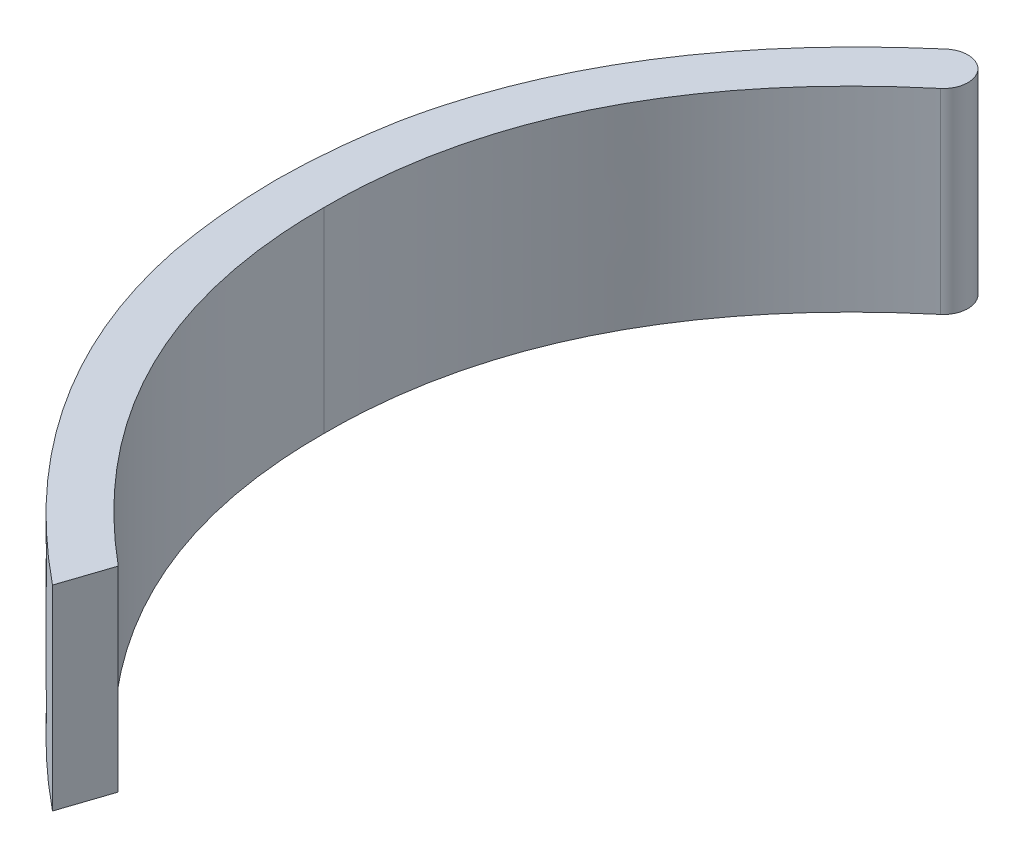
ISO-10303-21;
HEADER;
FILE_DESCRIPTION(('STEP AP214'),'2;1');
FILE_NAME('part.step','',(''),(''),'','','');
FILE_SCHEMA(('AUTOMOTIVE_DESIGN { 1 0 10303 214 1 1 1 1 }'));
ENDSEC;
DATA;
#1=APPLICATION_CONTEXT('core data for automotive mechanical design processes');
#2=APPLICATION_PROTOCOL_DEFINITION('international standard','automotive_design',2000,#1);
#3=PRODUCT_CONTEXT('',#1,'mechanical');
#4=PRODUCT('Part','Part','',(#3));
#5=PRODUCT_RELATED_PRODUCT_CATEGORY('part','',(#4));
#6=PRODUCT_DEFINITION_FORMATION('','',#4);
#7=PRODUCT_DEFINITION_CONTEXT('part definition',#1,'design');
#8=PRODUCT_DEFINITION('design','',#6,#7);
#9=PRODUCT_DEFINITION_SHAPE('','',#8);
#10=(LENGTH_UNIT() NAMED_UNIT(*) SI_UNIT(.MILLI.,.METRE.));
#11=(NAMED_UNIT(*) PLANE_ANGLE_UNIT() SI_UNIT($,.RADIAN.));
#12=(NAMED_UNIT(*) SI_UNIT($,.STERADIAN.) SOLID_ANGLE_UNIT());
#13=UNCERTAINTY_MEASURE_WITH_UNIT(LENGTH_MEASURE(1.E-05),#10,'distance_accuracy_value','');
#14=(GEOMETRIC_REPRESENTATION_CONTEXT(3) GLOBAL_UNCERTAINTY_ASSIGNED_CONTEXT((#13)) GLOBAL_UNIT_ASSIGNED_CONTEXT((#10,
#11,#12)) REPRESENTATION_CONTEXT('',''));
#15=CARTESIAN_POINT('',(0.,0.,0.));
#16=DIRECTION('',(0.,0.,1.));
#17=DIRECTION('',(1.,0.,0.));
#18=AXIS2_PLACEMENT_3D('',#15,#16,#17);
#19=CARTESIAN_POINT('',(0.,8.,-17.5));
#20=CARTESIAN_POINT('',(-11.3376797968367,8.,-8.58574448251679));
#21=CARTESIAN_POINT('',(-8.75,8.,4.60786437626908));
#22=B_SPLINE_CURVE_WITH_KNOTS('',2,(#19,#20,#21),.UNSPECIFIED.,.F.,.F.,(3,3),(0.,1.),.UNSPECIFIED.);
#23=DIRECTION('',(0.,-1.,0.));
#24=VECTOR('',#23,1.);
#25=SURFACE_OF_LINEAR_EXTRUSION('',#22,#24);
#26=CARTESIAN_POINT('',(0.,0.,-17.5));
#27=CARTESIAN_POINT('',(-11.3376797968367,0.,-8.58574448251679));
#28=CARTESIAN_POINT('',(-8.75,0.,4.60786437626908));
#29=B_SPLINE_CURVE_WITH_KNOTS('',2,(#26,#27,#28),.UNSPECIFIED.,.F.,.F.,(3,3),(0.,1.),.UNSPECIFIED.);
#30=CARTESIAN_POINT('',(-0.847715492399603,0.,-16.8111627582019));
#31=VERTEX_POINT('',#30);
#32=CARTESIAN_POINT('',(-9.23036205750921,0.,-4.0936220819382E-07));
#33=VERTEX_POINT('',#32);
#34=EDGE_CURVE('E152',#31,#33,#29,.T.);
#35=ORIENTED_EDGE('',*,*,#34,.F.);
#36=DIRECTION('',(0.,-1.,0.));
#37=VECTOR('',#36,1.);
#38=CARTESIAN_POINT('',(-0.847715492399604,0.,-16.8111627582019));
#39=LINE('',#38,#37);
#40=CARTESIAN_POINT('',(-0.847715492399606,8.,-16.8111627582019));
#41=VERTEX_POINT('',#40);
#42=EDGE_CURVE('E11',#31,#41,#39,.F.);
#43=ORIENTED_EDGE('',*,*,#42,.T.);
#44=CARTESIAN_POINT('',(-9.23036205750921,8.,-4.0936220819382E-07));
#45=VERTEX_POINT('',#44);
#46=EDGE_CURVE('E116',#41,#45,#22,.T.);
#47=ORIENTED_EDGE('',*,*,#46,.T.);
#48=DIRECTION('',(0.,-1.,0.));
#49=VECTOR('',#48,1.);
#50=CARTESIAN_POINT('',(-9.23036205750921,8.,-4.0936220819382E-07));
#51=LINE('',#50,#49);
#52=EDGE_CURVE('E146',#45,#33,#51,.T.);
#53=ORIENTED_EDGE('',*,*,#52,.T.);
#54=EDGE_LOOP('',(#35,#43,#47,#53));
#55=FACE_BOUND('',#54,.T.);
#56=ADVANCED_FACE('F37',(#55),#25,.T.);
#57=CARTESIAN_POINT('',(-1.41421356237309,8.,-18.9142135623731));
#58=CARTESIAN_POINT('',(-13.2681796996434,8.,-9.29044936772499));
#59=CARTESIAN_POINT('',(-10.75,8.,4.607864376269));
#60=B_SPLINE_CURVE_WITH_KNOTS('',2,(#57,#58,#59),.UNSPECIFIED.,.F.,.F.,(3,3),(0.,1.),.UNSPECIFIED.);
#61=DIRECTION('',(0.,-1.,0.));
#62=VECTOR('',#61,1.);
#63=SURFACE_OF_LINEAR_EXTRUSION('',#60,#62);
#64=CARTESIAN_POINT('',(-2.12549623723815,8.,-18.3218541518477));
#65=VERTEX_POINT('',#64);
#66=CARTESIAN_POINT('',(-10.7500095551566,8.,-4.60781732303904));
#67=VERTEX_POINT('',#66);
#68=EDGE_CURVE('E107',#65,#67,#60,.T.);
#69=ORIENTED_EDGE('',*,*,#68,.F.);
#70=DIRECTION('',(0.,-1.,0.));
#71=VECTOR('',#70,1.);
#72=CARTESIAN_POINT('',(-2.12549623724206,8.,-18.3218541518443));
#73=LINE('',#72,#71);
#74=CARTESIAN_POINT('',(-2.12549623723815,0.,-18.3218541518477));
#75=VERTEX_POINT('',#74);
#76=EDGE_CURVE('E127',#65,#75,#73,.T.);
#77=ORIENTED_EDGE('',*,*,#76,.T.);
#78=CARTESIAN_POINT('',(-1.41421356237309,0.,-18.9142135623731));
#79=CARTESIAN_POINT('',(-13.2681796996434,0.,-9.29044936772499));
#80=CARTESIAN_POINT('',(-10.75,0.,4.607864376269));
#81=B_SPLINE_CURVE_WITH_KNOTS('',2,(#78,#79,#80),.UNSPECIFIED.,.F.,.F.,(3,3),(0.,1.),.UNSPECIFIED.);
#82=CARTESIAN_POINT('',(-10.7500095551566,0.,-4.60781732303904));
#83=VERTEX_POINT('',#82);
#84=EDGE_CURVE('E123',#75,#83,#81,.T.);
#85=ORIENTED_EDGE('',*,*,#84,.T.);
#86=DIRECTION('',(0.,-1.,0.));
#87=VECTOR('',#86,1.);
#88=CARTESIAN_POINT('',(-10.7500095551566,8.,-4.60781732303904));
#89=LINE('',#88,#87);
#90=EDGE_CURVE('E120',#67,#83,#89,.T.);
#91=ORIENTED_EDGE('',*,*,#90,.F.);
#92=EDGE_LOOP('',(#69,#77,#85,#91));
#93=FACE_BOUND('',#92,.T.);
#94=ADVANCED_FACE('F121',(#93),#63,.F.);
#95=CARTESIAN_POINT('',(-1.41421356237309,8.,18.9142135623731));
#96=CARTESIAN_POINT('',(-13.2681796996434,8.,9.29044936772497));
#97=CARTESIAN_POINT('',(-10.75,8.,-4.60786437626904));
#98=B_SPLINE_CURVE_WITH_KNOTS('',2,(#95,#96,#97),.UNSPECIFIED.,.F.,.F.,(3,3),(0.,1.),.UNSPECIFIED.);
#99=DIRECTION('',(0.,-1.,0.));
#100=VECTOR('',#99,1.);
#101=SURFACE_OF_LINEAR_EXTRUSION('',#98,#100);
#102=CARTESIAN_POINT('',(-1.41421356237309,0.,18.9142135623731));
#103=CARTESIAN_POINT('',(-13.2681796996434,0.,9.29044936772497));
#104=CARTESIAN_POINT('',(-10.75,0.,-4.60786437626904));
#105=B_SPLINE_CURVE_WITH_KNOTS('',2,(#102,#103,#104),.UNSPECIFIED.,.F.,.F.,(3,3),(0.,1.),.UNSPECIFIED.);
#106=CARTESIAN_POINT('',(-11.1908593131913,0.,-2.23029348895426E-08));
#107=VERTEX_POINT('',#106);
#108=EDGE_CURVE('E228',#107,#83,#105,.T.);
#109=ORIENTED_EDGE('',*,*,#108,.F.);
#110=DIRECTION('',(0.,-1.,0.));
#111=VECTOR('',#110,1.);
#112=CARTESIAN_POINT('',(-11.1908593131913,8.,-2.23029348895426E-08));
#113=LINE('',#112,#111);
#114=CARTESIAN_POINT('',(-11.1908593131913,8.,-2.23029348895426E-08));
#115=VERTEX_POINT('',#114);
#116=EDGE_CURVE('E128',#115,#107,#113,.T.);
#117=ORIENTED_EDGE('',*,*,#116,.F.);
#118=EDGE_CURVE('E111',#115,#67,#98,.T.);
#119=ORIENTED_EDGE('',*,*,#118,.T.);
#120=ORIENTED_EDGE('',*,*,#90,.T.);
#121=EDGE_LOOP('',(#109,#117,#119,#120));
#122=FACE_BOUND('',#121,.T.);
#123=ADVANCED_FACE('F130',(#122),#101,.T.);
#124=CARTESIAN_POINT('',(-10.75,0.,4.607864376269));
#125=VERTEX_POINT('',#124);
#126=EDGE_CURVE('E229',#107,#125,#81,.T.);
#127=ORIENTED_EDGE('',*,*,#126,.T.);
#128=DIRECTION('',(0.,-1.,0.));
#129=VECTOR('',#128,1.);
#130=CARTESIAN_POINT('',(-10.75,8.,4.607864376269));
#131=LINE('',#130,#129);
#132=CARTESIAN_POINT('',(-10.75,8.,4.607864376269));
#133=VERTEX_POINT('',#132);
#134=EDGE_CURVE('E213',#133,#125,#131,.T.);
#135=ORIENTED_EDGE('',*,*,#134,.F.);
#136=EDGE_CURVE('E118',#115,#133,#60,.T.);
#137=ORIENTED_EDGE('',*,*,#136,.F.);
#138=ORIENTED_EDGE('',*,*,#116,.T.);
#139=EDGE_LOOP('',(#127,#135,#137,#138));
#140=FACE_BOUND('',#139,.T.);
#141=ADVANCED_FACE('F174',(#140),#63,.F.);
#142=CARTESIAN_POINT('',(-1.41421356237309,0.,18.9142135623731));
#143=VERTEX_POINT('',#142);
#144=EDGE_CURVE('E199',#143,#125,#105,.T.);
#145=ORIENTED_EDGE('',*,*,#144,.F.);
#146=DIRECTION('',(0.,-1.,0.));
#147=VECTOR('',#146,1.);
#148=CARTESIAN_POINT('',(-1.41421356237309,8.,18.9142135623731));
#149=LINE('',#148,#147);
#150=CARTESIAN_POINT('',(-1.41421356237309,8.,18.9142135623731));
#151=VERTEX_POINT('',#150);
#152=EDGE_CURVE('E211',#151,#143,#149,.T.);
#153=ORIENTED_EDGE('',*,*,#152,.F.);
#154=EDGE_CURVE('E133',#151,#133,#98,.T.);
#155=ORIENTED_EDGE('',*,*,#154,.T.);
#156=ORIENTED_EDGE('',*,*,#134,.T.);
#157=EDGE_LOOP('',(#145,#153,#155,#156));
#158=FACE_BOUND('',#157,.T.);
#159=ADVANCED_FACE('F170',(#158),#101,.T.);
#160=CARTESIAN_POINT('',(4.4014718625761,8.,1.46715728752535));
#161=DIRECTION('',(-0.948683298050515,0.,-0.316227766016835));
#162=DIRECTION('',(-0.316227766016835,0.,0.948683298050515));
#163=AXIS2_PLACEMENT_3D('',#160,#161,#162);
#164=PLANE('',#163);
#165=DIRECTION('',(0.316227766016835,0.,-0.948683298050515));
#166=VECTOR('',#165,1.);
#167=CARTESIAN_POINT('',(4.4014718625761,0.,1.46715728752535));
#168=LINE('',#167,#166);
#169=CARTESIAN_POINT('',(-0.742530403417585,0.,16.8991640855066));
#170=VERTEX_POINT('',#169);
#171=EDGE_CURVE('E194',#143,#170,#168,.T.);
#172=ORIENTED_EDGE('',*,*,#171,.T.);
#173=DIRECTION('',(0.,-1.,0.));
#174=VECTOR('',#173,1.);
#175=CARTESIAN_POINT('',(-0.742530403417585,8.,16.8991640855066));
#176=LINE('',#175,#174);
#177=CARTESIAN_POINT('',(-0.742530403417585,8.,16.8991640855066));
#178=VERTEX_POINT('',#177);
#179=EDGE_CURVE('E209',#178,#170,#176,.T.);
#180=ORIENTED_EDGE('',*,*,#179,.F.);
#181=DIRECTION('',(0.316227766016835,0.,-0.948683298050515));
#182=VECTOR('',#181,1.);
#183=CARTESIAN_POINT('',(4.4014718625761,8.,1.46715728752535));
#184=LINE('',#183,#182);
#185=EDGE_CURVE('E139',#151,#178,#184,.T.);
#186=ORIENTED_EDGE('',*,*,#185,.F.);
#187=ORIENTED_EDGE('',*,*,#152,.T.);
#188=EDGE_LOOP('',(#172,#180,#186,#187));
#189=FACE_BOUND('',#188,.T.);
#190=ADVANCED_FACE('F164',(#189),#164,.F.);
#191=CARTESIAN_POINT('',(0.,8.,17.5));
#192=CARTESIAN_POINT('',(-11.3376797968367,8.,8.58574448251684));
#193=CARTESIAN_POINT('',(-8.75,8.,-4.60786437626901));
#194=B_SPLINE_CURVE_WITH_KNOTS('',2,(#191,#192,#193),.UNSPECIFIED.,.F.,.F.,(3,3),(0.,1.),.UNSPECIFIED.);
#195=DIRECTION('',(0.,-1.,0.));
#196=VECTOR('',#195,1.);
#197=SURFACE_OF_LINEAR_EXTRUSION('',#194,#196);
#198=CARTESIAN_POINT('',(0.,0.,17.5));
#199=CARTESIAN_POINT('',(-11.3376797968367,0.,8.58574448251684));
#200=CARTESIAN_POINT('',(-8.75,0.,-4.60786437626901));
#201=B_SPLINE_CURVE_WITH_KNOTS('',2,(#198,#199,#200),.UNSPECIFIED.,.F.,.F.,(3,3),(0.,1.),.UNSPECIFIED.);
#202=EDGE_CURVE('E188',#170,#33,#201,.T.);
#203=ORIENTED_EDGE('',*,*,#202,.T.);
#204=ORIENTED_EDGE('',*,*,#52,.F.);
#205=EDGE_CURVE('E142',#178,#45,#194,.T.);
#206=ORIENTED_EDGE('',*,*,#205,.F.);
#207=ORIENTED_EDGE('',*,*,#179,.T.);
#208=EDGE_LOOP('',(#203,#204,#206,#207));
#209=FACE_BOUND('',#208,.T.);
#210=ADVANCED_FACE('F160',(#209),#197,.F.);
#211=CARTESIAN_POINT('',(0.,8.,0.));
#212=DIRECTION('',(0.,1.,0.));
#213=DIRECTION('',(0.,0.,1.));
#214=AXIS2_PLACEMENT_3D('',#211,#212,#213);
#215=PLANE('',#214);
#216=CARTESIAN_POINT('',(-1.49100192481588,8.,-17.5767883624428));
#217=DIRECTION('',(0.,1.,0.));
#218=DIRECTION('',(0.,0.,1.));
#219=AXIS2_PLACEMENT_3D('',#216,#217,#218);
#220=CIRCLE('',#219,1.);
#221=CARTESIAN_POINT('',(-0.776354715976421,8.,-18.2762734351198));
#222=VERTEX_POINT('',#221);
#223=EDGE_CURVE('E53',#41,#222,#220,.T.);
#224=ORIENTED_EDGE('',*,*,#223,.T.);
#225=CARTESIAN_POINT('',(-1.47583978865348,8.,-17.5616262262804));
#226=DIRECTION('',(0.,1.,0.));
#227=DIRECTION('',(0.,0.,1.));
#228=AXIS2_PLACEMENT_3D('',#225,#226,#227);
#229=CIRCLE('',#228,1.);
#230=EDGE_CURVE('E46',#222,#65,#229,.T.);
#231=ORIENTED_EDGE('',*,*,#230,.T.);
#232=ORIENTED_EDGE('',*,*,#68,.T.);
#233=ORIENTED_EDGE('',*,*,#118,.F.);
#234=ORIENTED_EDGE('',*,*,#136,.T.);
#235=ORIENTED_EDGE('',*,*,#154,.F.);
#236=ORIENTED_EDGE('',*,*,#185,.T.);
#237=ORIENTED_EDGE('',*,*,#205,.T.);
#238=ORIENTED_EDGE('',*,*,#46,.F.);
#239=EDGE_LOOP('',(#224,#231,#232,#233,#234,#235,#236,#237,#238));
#240=FACE_BOUND('',#239,.T.);
#241=ADVANCED_FACE('F109',(#240),#215,.T.);
#242=CARTESIAN_POINT('',(0.,0.,0.));
#243=DIRECTION('',(0.,1.,0.));
#244=DIRECTION('',(0.,0.,1.));
#245=AXIS2_PLACEMENT_3D('',#242,#243,#244);
#246=PLANE('',#245);
#247=ORIENTED_EDGE('',*,*,#84,.F.);
#248=CARTESIAN_POINT('',(-1.47583978865348,0.,-17.5616262262804));
#249=DIRECTION('',(0.,1.,0.));
#250=DIRECTION('',(0.,0.,1.));
#251=AXIS2_PLACEMENT_3D('',#248,#249,#250);
#252=CIRCLE('',#251,1.);
#253=CARTESIAN_POINT('',(-0.776354715976421,0.,-18.2762734351198));
#254=VERTEX_POINT('',#253);
#255=EDGE_CURVE('E219',#75,#254,#252,.F.);
#256=ORIENTED_EDGE('',*,*,#255,.T.);
#257=CARTESIAN_POINT('',(-1.49100192481588,0.,-17.5767883624428));
#258=DIRECTION('',(0.,1.,0.));
#259=DIRECTION('',(0.,0.,1.));
#260=AXIS2_PLACEMENT_3D('',#257,#258,#259);
#261=CIRCLE('',#260,1.);
#262=EDGE_CURVE('E217',#254,#31,#261,.F.);
#263=ORIENTED_EDGE('',*,*,#262,.T.);
#264=ORIENTED_EDGE('',*,*,#34,.T.);
#265=ORIENTED_EDGE('',*,*,#202,.F.);
#266=ORIENTED_EDGE('',*,*,#171,.F.);
#267=ORIENTED_EDGE('',*,*,#144,.T.);
#268=ORIENTED_EDGE('',*,*,#126,.F.);
#269=ORIENTED_EDGE('',*,*,#108,.T.);
#270=EDGE_LOOP('',(#247,#256,#263,#264,#265,#266,#267,#268,#269));
#271=FACE_BOUND('',#270,.T.);
#272=ADVANCED_FACE('F166',(#271),#246,.F.);
#273=CARTESIAN_POINT('',(-1.49100192481588,4.,-17.5767883624428));
#274=DIRECTION('',(0.,-1.,0.));
#275=DIRECTION('',(0.,0.,-1.));
#276=AXIS2_PLACEMENT_3D('',#273,#274,#275);
#277=CYLINDRICAL_SURFACE('',#276,1.);
#278=DIRECTION('',(0.,-1.,0.));
#279=VECTOR('',#278,1.);
#280=CARTESIAN_POINT('',(-0.776354715976421,4.,-18.2762734351198));
#281=LINE('',#280,#279);
#282=EDGE_CURVE('E41',#222,#254,#281,.T.);
#283=ORIENTED_EDGE('',*,*,#282,.F.);
#284=ORIENTED_EDGE('',*,*,#223,.F.);
#285=ORIENTED_EDGE('',*,*,#42,.F.);
#286=ORIENTED_EDGE('',*,*,#262,.F.);
#287=EDGE_LOOP('',(#283,#284,#285,#286));
#288=FACE_BOUND('',#287,.T.);
#289=ADVANCED_FACE('F39',(#288),#277,.T.);
#290=CARTESIAN_POINT('',(-1.47583978865348,4.,-17.5616262262804));
#291=DIRECTION('',(0.,-1.,0.));
#292=DIRECTION('',(0.,0.,-1.));
#293=AXIS2_PLACEMENT_3D('',#290,#291,#292);
#294=CYLINDRICAL_SURFACE('',#293,1.);
#295=ORIENTED_EDGE('',*,*,#230,.F.);
#296=ORIENTED_EDGE('',*,*,#282,.T.);
#297=ORIENTED_EDGE('',*,*,#255,.F.);
#298=ORIENTED_EDGE('',*,*,#76,.F.);
#299=EDGE_LOOP('',(#295,#296,#297,#298));
#300=FACE_BOUND('',#299,.T.);
#301=ADVANCED_FACE('F227',(#300),#294,.T.);
#302=CLOSED_SHELL('',(#56,#94,#123,#141,#159,#190,#210,#241,#272,#289,#301));
#303=MANIFOLD_SOLID_BREP('B2',#302);
#304=ADVANCED_BREP_SHAPE_REPRESENTATION('',(#18,#303),#14);
#305=SHAPE_DEFINITION_REPRESENTATION(#9,#304);
ENDSEC;
END-ISO-10303-21;
